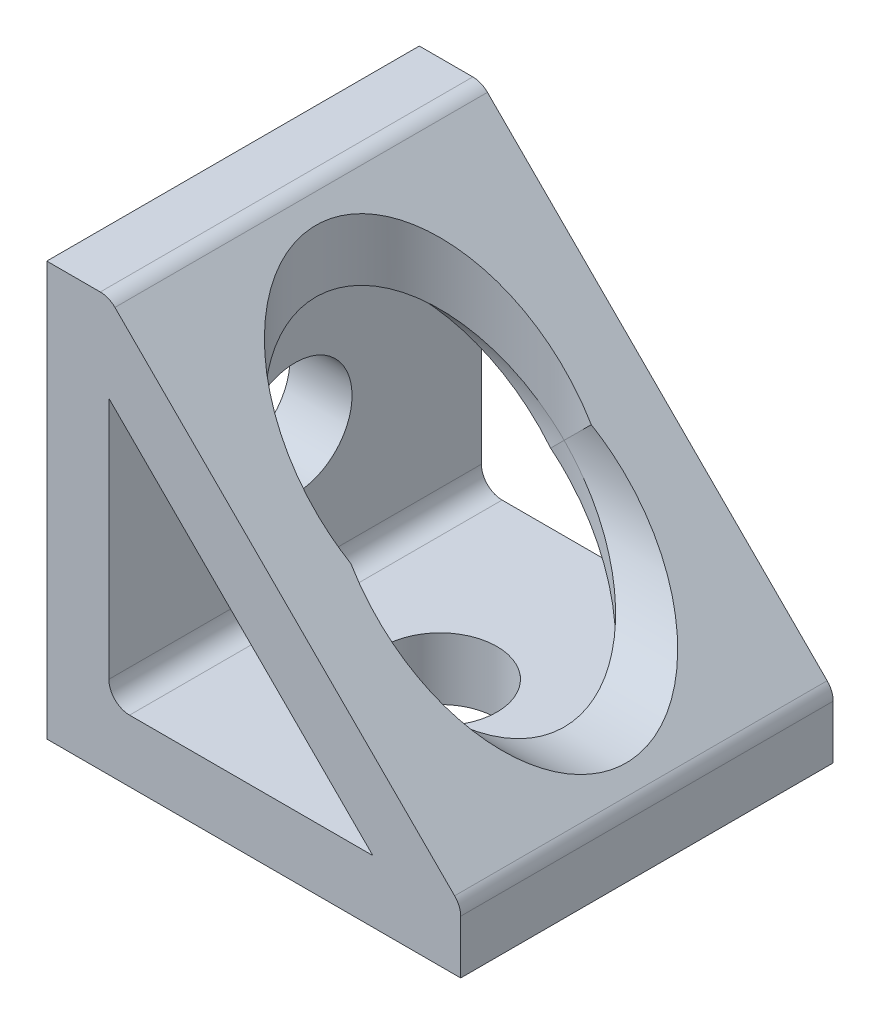
ISO-10303-21;
HEADER;
FILE_DESCRIPTION(('STEP AP214'),'2;1');
FILE_NAME('part.step','',(''),(''),'','','');
FILE_SCHEMA(('AUTOMOTIVE_DESIGN { 1 0 10303 214 1 1 1 1 }'));
ENDSEC;
DATA;
#1=APPLICATION_CONTEXT('core data for automotive mechanical design processes');
#2=APPLICATION_PROTOCOL_DEFINITION('international standard','automotive_design',2000,#1);
#3=PRODUCT_CONTEXT('',#1,'mechanical');
#4=PRODUCT('Part','Part','',(#3));
#5=PRODUCT_RELATED_PRODUCT_CATEGORY('part','',(#4));
#6=PRODUCT_DEFINITION_FORMATION('','',#4);
#7=PRODUCT_DEFINITION_CONTEXT('part definition',#1,'design');
#8=PRODUCT_DEFINITION('design','',#6,#7);
#9=PRODUCT_DEFINITION_SHAPE('','',#8);
#10=(LENGTH_UNIT() NAMED_UNIT(*) SI_UNIT(.MILLI.,.METRE.));
#11=(NAMED_UNIT(*) PLANE_ANGLE_UNIT() SI_UNIT($,.RADIAN.));
#12=(NAMED_UNIT(*) SI_UNIT($,.STERADIAN.) SOLID_ANGLE_UNIT());
#13=UNCERTAINTY_MEASURE_WITH_UNIT(LENGTH_MEASURE(1.E-05),#10,'distance_accuracy_value','');
#14=(GEOMETRIC_REPRESENTATION_CONTEXT(3) GLOBAL_UNCERTAINTY_ASSIGNED_CONTEXT((#13)) GLOBAL_UNIT_ASSIGNED_CONTEXT((#10,
#11,#12)) REPRESENTATION_CONTEXT('',''));
#15=CARTESIAN_POINT('',(0.,0.,0.));
#16=DIRECTION('',(0.,0.,1.));
#17=DIRECTION('',(1.,0.,0.));
#18=AXIS2_PLACEMENT_3D('',#15,#16,#17);
#19=CARTESIAN_POINT('',(4.,4.,-9.));
#20=DIRECTION('',(0.,0.,-1.));
#21=DIRECTION('',(-1.,0.,0.));
#22=AXIS2_PLACEMENT_3D('',#19,#20,#21);
#23=CYLINDRICAL_SURFACE('',#22,1.);
#24=DIRECTION('',(0.,0.,1.));
#25=VECTOR('',#24,1.);
#26=CARTESIAN_POINT('',(3.,4.,-9.));
#27=LINE('',#26,#25);
#28=CARTESIAN_POINT('',(3.,4.,-9.));
#29=VERTEX_POINT('',#28);
#30=CARTESIAN_POINT('',(3.,4.,9.));
#31=VERTEX_POINT('',#30);
#32=EDGE_CURVE('E143',#29,#31,#27,.T.);
#33=ORIENTED_EDGE('',*,*,#32,.T.);
#34=CARTESIAN_POINT('',(4.,4.,9.));
#35=DIRECTION('',(0.,0.,-1.));
#36=DIRECTION('',(-1.,0.,0.));
#37=AXIS2_PLACEMENT_3D('',#34,#35,#36);
#38=CIRCLE('',#37,1.);
#39=CARTESIAN_POINT('',(4.,3.,9.));
#40=VERTEX_POINT('',#39);
#41=EDGE_CURVE('E21',#40,#31,#38,.T.);
#42=ORIENTED_EDGE('',*,*,#41,.F.);
#43=DIRECTION('',(0.,0.,1.));
#44=VECTOR('',#43,1.);
#45=CARTESIAN_POINT('',(4.,3.,-9.));
#46=LINE('',#45,#44);
#47=CARTESIAN_POINT('',(4.,3.,-9.));
#48=VERTEX_POINT('',#47);
#49=EDGE_CURVE('E271',#40,#48,#46,.F.);
#50=ORIENTED_EDGE('',*,*,#49,.T.);
#51=CARTESIAN_POINT('',(4.,4.,-9.));
#52=DIRECTION('',(0.,0.,-1.));
#53=DIRECTION('',(-1.,0.,0.));
#54=AXIS2_PLACEMENT_3D('',#51,#52,#53);
#55=CIRCLE('',#54,1.);
#56=EDGE_CURVE('E141',#29,#48,#55,.F.);
#57=ORIENTED_EDGE('',*,*,#56,.F.);
#58=EDGE_LOOP('',(#33,#42,#50,#57));
#59=FACE_BOUND('',#58,.T.);
#60=ADVANCED_FACE('F18',(#59),#23,.F.);
#61=CARTESIAN_POINT('',(10.,20.,0.));
#62=DIRECTION('',(0.,-1.,0.));
#63=DIRECTION('',(1.,0.,0.));
#64=AXIS2_PLACEMENT_3D('',#61,#62,#63);
#65=CYLINDRICAL_SURFACE('',#64,6.);
#66=CARTESIAN_POINT('',(10.,10.,0.));
#67=DIRECTION('',(-0.707106781186548,-0.707106781186547,0.));
#68=DIRECTION('',(0.707106781186547,-0.707106781186548,0.));
#69=AXIS2_PLACEMENT_3D('',#66,#67,#68);
#70=ELLIPSE('',#69,8.48528137423857,6.);
#71=CARTESIAN_POINT('',(10.,10.,6.));
#72=VERTEX_POINT('',#71);
#73=CARTESIAN_POINT('',(10.,10.,-6.));
#74=VERTEX_POINT('',#73);
#75=EDGE_CURVE('E293',#72,#74,#70,.F.);
#76=ORIENTED_EDGE('',*,*,#75,.T.);
#77=CARTESIAN_POINT('',(10.,10.,0.));
#78=DIRECTION('',(0.707106781186547,-0.707106781186548,0.));
#79=DIRECTION('',(-0.707106781186548,-0.707106781186547,0.));
#80=AXIS2_PLACEMENT_3D('',#77,#78,#79);
#81=ELLIPSE('',#80,8.48528137423857,6.);
#82=CARTESIAN_POINT('',(9.37867965644037,9.37867965644034,-5.96774337842027));
#83=VERTEX_POINT('',#82);
#84=EDGE_CURVE('E308',#74,#83,#81,.F.);
#85=ORIENTED_EDGE('',*,*,#84,.T.);
#86=CARTESIAN_POINT('',(10.,8.75735931288071,0.));
#87=DIRECTION('',(0.707106781186547,0.707106781186548,0.));
#88=DIRECTION('',(0.707106781186548,-0.707106781186547,0.));
#89=AXIS2_PLACEMENT_3D('',#86,#87,#88);
#90=ELLIPSE('',#89,8.48528137423857,6.);
#91=CARTESIAN_POINT('',(15.7573593128807,3.,-1.68902745459798));
#92=VERTEX_POINT('',#91);
#93=EDGE_CURVE('E253',#83,#92,#90,.F.);
#94=ORIENTED_EDGE('',*,*,#93,.T.);
#95=CARTESIAN_POINT('',(10.,3.,0.));
#96=DIRECTION('',(0.,-1.,0.));
#97=DIRECTION('',(1.,0.,0.));
#98=AXIS2_PLACEMENT_3D('',#95,#96,#97);
#99=CIRCLE('',#98,6.);
#100=CARTESIAN_POINT('',(15.7573593128807,3.,1.68902745459798));
#101=VERTEX_POINT('',#100);
#102=EDGE_CURVE('E147',#92,#101,#99,.T.);
#103=ORIENTED_EDGE('',*,*,#102,.T.);
#104=CARTESIAN_POINT('',(10.,8.75735931288071,0.));
#105=DIRECTION('',(0.707106781186547,0.707106781186548,0.));
#106=DIRECTION('',(0.707106781186548,-0.707106781186547,0.));
#107=AXIS2_PLACEMENT_3D('',#104,#105,#106);
#108=ELLIPSE('',#107,8.48528137423857,6.);
#109=CARTESIAN_POINT('',(9.37867965644038,9.37867965644033,5.96774337842026));
#110=VERTEX_POINT('',#109);
#111=EDGE_CURVE('E284',#101,#110,#108,.F.);
#112=ORIENTED_EDGE('',*,*,#111,.T.);
#113=CARTESIAN_POINT('',(10.,10.,0.));
#114=DIRECTION('',(0.707106781186547,-0.707106781186548,0.));
#115=DIRECTION('',(-0.707106781186548,-0.707106781186547,0.));
#116=AXIS2_PLACEMENT_3D('',#113,#114,#115);
#117=ELLIPSE('',#116,8.48528137423857,6.);
#118=EDGE_CURVE('E311',#110,#72,#117,.F.);
#119=ORIENTED_EDGE('',*,*,#118,.T.);
#120=EDGE_LOOP('',(#76,#85,#94,#103,#112,#119));
#121=FACE_BOUND('',#120,.T.);
#122=ADVANCED_FACE('F351',(#121),#65,.F.);
#123=CARTESIAN_POINT('',(20.,10.,0.));
#124=DIRECTION('',(-1.,0.,0.));
#125=DIRECTION('',(0.,-1.,0.));
#126=AXIS2_PLACEMENT_3D('',#123,#124,#125);
#127=CYLINDRICAL_SURFACE('',#126,6.);
#128=ORIENTED_EDGE('',*,*,#84,.F.);
#129=CARTESIAN_POINT('',(10.,10.,0.));
#130=DIRECTION('',(-0.707106781186548,-0.707106781186547,0.));
#131=DIRECTION('',(-0.707106781186547,0.707106781186548,0.));
#132=AXIS2_PLACEMENT_3D('',#129,#130,#131);
#133=ELLIPSE('',#132,8.48528137423857,6.);
#134=EDGE_CURVE('E304',#74,#72,#133,.F.);
#135=ORIENTED_EDGE('',*,*,#134,.T.);
#136=ORIENTED_EDGE('',*,*,#118,.F.);
#137=CARTESIAN_POINT('',(8.75735931288071,10.,0.));
#138=DIRECTION('',(0.707106781186547,0.707106781186548,0.));
#139=DIRECTION('',(-0.707106781186548,0.707106781186547,0.));
#140=AXIS2_PLACEMENT_3D('',#137,#138,#139);
#141=ELLIPSE('',#140,8.48528137423857,6.);
#142=CARTESIAN_POINT('',(3.,15.7573593128807,1.689027454598));
#143=VERTEX_POINT('',#142);
#144=EDGE_CURVE('E281',#110,#143,#141,.F.);
#145=ORIENTED_EDGE('',*,*,#144,.T.);
#146=CARTESIAN_POINT('',(3.,10.,0.));
#147=DIRECTION('',(-1.,0.,0.));
#148=DIRECTION('',(0.,-1.,0.));
#149=AXIS2_PLACEMENT_3D('',#146,#147,#148);
#150=CIRCLE('',#149,6.);
#151=CARTESIAN_POINT('',(3.,15.7573593128807,-1.689027454598));
#152=VERTEX_POINT('',#151);
#153=EDGE_CURVE('E148',#143,#152,#150,.T.);
#154=ORIENTED_EDGE('',*,*,#153,.T.);
#155=CARTESIAN_POINT('',(8.75735931288071,10.,0.));
#156=DIRECTION('',(0.707106781186547,0.707106781186548,0.));
#157=DIRECTION('',(-0.707106781186548,0.707106781186547,0.));
#158=AXIS2_PLACEMENT_3D('',#155,#156,#157);
#159=ELLIPSE('',#158,8.48528137423857,6.);
#160=EDGE_CURVE('E216',#152,#83,#159,.F.);
#161=ORIENTED_EDGE('',*,*,#160,.T.);
#162=EDGE_LOOP('',(#128,#135,#136,#145,#154,#161));
#163=FACE_BOUND('',#162,.T.);
#164=ADVANCED_FACE('F356',(#163),#127,.F.);
#165=CARTESIAN_POINT('',(10.,20.,0.));
#166=DIRECTION('',(0.,-1.,0.));
#167=DIRECTION('',(1.,0.,0.));
#168=AXIS2_PLACEMENT_3D('',#165,#166,#167);
#169=CYLINDRICAL_SURFACE('',#168,6.);
#170=ORIENTED_EDGE('',*,*,#134,.F.);
#171=CARTESIAN_POINT('',(10.,10.,0.));
#172=DIRECTION('',(0.707106781186547,-0.707106781186548,0.));
#173=DIRECTION('',(-0.707106781186548,-0.707106781186547,0.));
#174=AXIS2_PLACEMENT_3D('',#171,#172,#173);
#175=ELLIPSE('',#174,8.48528137423857,6.);
#176=CARTESIAN_POINT('',(11.5,11.5,-5.80947501931113));
#177=VERTEX_POINT('',#176);
#178=EDGE_CURVE('E300',#74,#177,#175,.T.);
#179=ORIENTED_EDGE('',*,*,#178,.T.);
#180=CARTESIAN_POINT('',(10.,13.,0.));
#181=DIRECTION('',(0.707106781186548,0.707106781186548,0.));
#182=DIRECTION('',(0.707106781186548,-0.707106781186548,0.));
#183=AXIS2_PLACEMENT_3D('',#180,#181,#182);
#184=ELLIPSE('',#183,8.48528137423857,6.);
#185=CARTESIAN_POINT('',(11.5,11.5,5.80947501931113));
#186=VERTEX_POINT('',#185);
#187=EDGE_CURVE('E257',#186,#177,#184,.F.);
#188=ORIENTED_EDGE('',*,*,#187,.F.);
#189=CARTESIAN_POINT('',(10.,10.,0.));
#190=DIRECTION('',(0.707106781186547,-0.707106781186548,0.));
#191=DIRECTION('',(-0.707106781186548,-0.707106781186547,0.));
#192=AXIS2_PLACEMENT_3D('',#189,#190,#191);
#193=ELLIPSE('',#192,8.48528137423857,6.);
#194=EDGE_CURVE('E296',#186,#72,#193,.T.);
#195=ORIENTED_EDGE('',*,*,#194,.T.);
#196=EDGE_LOOP('',(#170,#179,#188,#195));
#197=FACE_BOUND('',#196,.T.);
#198=ADVANCED_FACE('F363',(#197),#169,.F.);
#199=CARTESIAN_POINT('',(20.,10.,0.));
#200=DIRECTION('',(-1.,0.,0.));
#201=DIRECTION('',(0.,-1.,0.));
#202=AXIS2_PLACEMENT_3D('',#199,#200,#201);
#203=CYLINDRICAL_SURFACE('',#202,6.);
#204=CARTESIAN_POINT('',(13.,10.,0.));
#205=DIRECTION('',(0.707106781186548,0.707106781186548,0.));
#206=DIRECTION('',(-0.707106781186548,0.707106781186548,0.));
#207=AXIS2_PLACEMENT_3D('',#204,#205,#206);
#208=ELLIPSE('',#207,8.48528137423857,6.);
#209=EDGE_CURVE('E210',#177,#186,#208,.F.);
#210=ORIENTED_EDGE('',*,*,#209,.F.);
#211=ORIENTED_EDGE('',*,*,#178,.F.);
#212=ORIENTED_EDGE('',*,*,#75,.F.);
#213=ORIENTED_EDGE('',*,*,#194,.F.);
#214=EDGE_LOOP('',(#210,#211,#212,#213));
#215=FACE_BOUND('',#214,.T.);
#216=ADVANCED_FACE('F364',(#215),#203,.F.);
#217=CARTESIAN_POINT('',(19.,2.58578643762691,-9.));
#218=DIRECTION('',(0.,0.,1.));
#219=DIRECTION('',(1.,0.,0.));
#220=AXIS2_PLACEMENT_3D('',#217,#218,#219);
#221=CYLINDRICAL_SURFACE('',#220,1.);
#222=CARTESIAN_POINT('',(19.,2.58578643762691,9.));
#223=DIRECTION('',(0.,0.,1.));
#224=DIRECTION('',(1.,0.,0.));
#225=AXIS2_PLACEMENT_3D('',#222,#223,#224);
#226=CIRCLE('',#225,1.);
#227=CARTESIAN_POINT('',(19.7071067811865,3.29289321881345,9.));
#228=VERTEX_POINT('',#227);
#229=CARTESIAN_POINT('',(20.,2.58578643762691,9.));
#230=VERTEX_POINT('',#229);
#231=EDGE_CURVE('E287',#228,#230,#226,.F.);
#232=ORIENTED_EDGE('',*,*,#231,.T.);
#233=DIRECTION('',(0.,0.,-1.));
#234=VECTOR('',#233,1.);
#235=CARTESIAN_POINT('',(20.,2.58578643762691,-9.));
#236=LINE('',#235,#234);
#237=CARTESIAN_POINT('',(20.,2.58578643762691,-9.));
#238=VERTEX_POINT('',#237);
#239=EDGE_CURVE('E187',#238,#230,#236,.F.);
#240=ORIENTED_EDGE('',*,*,#239,.F.);
#241=CARTESIAN_POINT('',(19.,2.58578643762691,-9.));
#242=DIRECTION('',(0.,0.,1.));
#243=DIRECTION('',(1.,0.,0.));
#244=AXIS2_PLACEMENT_3D('',#241,#242,#243);
#245=CIRCLE('',#244,1.);
#246=CARTESIAN_POINT('',(19.7071067811865,3.29289321881345,-9.));
#247=VERTEX_POINT('',#246);
#248=EDGE_CURVE('E290',#238,#247,#245,.T.);
#249=ORIENTED_EDGE('',*,*,#248,.T.);
#250=DIRECTION('',(0.,0.,1.));
#251=VECTOR('',#250,1.);
#252=CARTESIAN_POINT('',(19.7071067811865,3.29289321881346,-9.));
#253=LINE('',#252,#251);
#254=EDGE_CURVE('E206',#228,#247,#253,.F.);
#255=ORIENTED_EDGE('',*,*,#254,.F.);
#256=EDGE_LOOP('',(#232,#240,#249,#255));
#257=FACE_BOUND('',#256,.T.);
#258=ADVANCED_FACE('F530',(#257),#221,.T.);
#259=CARTESIAN_POINT('',(10.,9.,0.));
#260=DIRECTION('',(0.,-1.,0.));
#261=DIRECTION('',(1.,0.,0.));
#262=AXIS2_PLACEMENT_3D('',#259,#260,#261);
#263=CYLINDRICAL_SURFACE('',#262,2.75);
#264=CARTESIAN_POINT('',(10.,0.,0.));
#265=DIRECTION('',(0.,-1.,0.));
#266=DIRECTION('',(1.,0.,0.));
#267=AXIS2_PLACEMENT_3D('',#264,#265,#266);
#268=CIRCLE('',#267,2.75);
#269=CARTESIAN_POINT('',(12.75,0.,0.));
#270=VERTEX_POINT('',#269);
#271=EDGE_CURVE('E202',#270,#270,#268,.F.);
#272=ORIENTED_EDGE('',*,*,#271,.F.);
#273=EDGE_LOOP('',(#272));
#274=FACE_BOUND('',#273,.T.);
#275=CARTESIAN_POINT('',(10.,3.,0.));
#276=DIRECTION('',(0.,-1.,0.));
#277=DIRECTION('',(1.,0.,0.));
#278=AXIS2_PLACEMENT_3D('',#275,#276,#277);
#279=CIRCLE('',#278,2.75);
#280=CARTESIAN_POINT('',(12.75,3.,0.));
#281=VERTEX_POINT('',#280);
#282=EDGE_CURVE('E267',#281,#281,#279,.F.);
#283=ORIENTED_EDGE('',*,*,#282,.T.);
#284=EDGE_LOOP('',(#283));
#285=FACE_BOUND('',#284,.T.);
#286=ADVANCED_FACE('F521',(#274,#285),#263,.F.);
#287=CARTESIAN_POINT('',(3.,15.7573593128807,-9.));
#288=DIRECTION('',(0.707106781186547,0.707106781186548,0.));
#289=DIRECTION('',(-0.707106781186548,0.707106781186547,0.));
#290=AXIS2_PLACEMENT_3D('',#287,#288,#289);
#291=PLANE('',#290);
#292=ORIENTED_EDGE('',*,*,#111,.F.);
#293=DIRECTION('',(0.,0.,1.));
#294=VECTOR('',#293,1.);
#295=CARTESIAN_POINT('',(15.7573593128807,3.,-9.));
#296=LINE('',#295,#294);
#297=CARTESIAN_POINT('',(15.7573593128807,3.,9.));
#298=VERTEX_POINT('',#297);
#299=EDGE_CURVE('E275',#101,#298,#296,.T.);
#300=ORIENTED_EDGE('',*,*,#299,.T.);
#301=DIRECTION('',(-0.707106781186548,0.707106781186547,0.));
#302=VECTOR('',#301,1.);
#303=CARTESIAN_POINT('',(15.7573593128807,3.,9.));
#304=LINE('',#303,#302);
#305=CARTESIAN_POINT('',(3.,15.7573593128807,9.));
#306=VERTEX_POINT('',#305);
#307=EDGE_CURVE('E157',#298,#306,#304,.T.);
#308=ORIENTED_EDGE('',*,*,#307,.T.);
#309=DIRECTION('',(0.,0.,1.));
#310=VECTOR('',#309,1.);
#311=CARTESIAN_POINT('',(3.,15.7573593128807,-9.));
#312=LINE('',#311,#310);
#313=EDGE_CURVE('E154',#306,#143,#312,.F.);
#314=ORIENTED_EDGE('',*,*,#313,.T.);
#315=ORIENTED_EDGE('',*,*,#144,.F.);
#316=EDGE_LOOP('',(#292,#300,#308,#314,#315));
#317=FACE_BOUND('',#316,.T.);
#318=ADVANCED_FACE('F355',(#317),#291,.F.);
#319=CARTESIAN_POINT('',(2.5857864376269,19.,-9.));
#320=DIRECTION('',(0.,0.,1.));
#321=DIRECTION('',(1.,0.,0.));
#322=AXIS2_PLACEMENT_3D('',#319,#320,#321);
#323=CYLINDRICAL_SURFACE('',#322,1.);
#324=CARTESIAN_POINT('',(2.5857864376269,19.,9.));
#325=DIRECTION('',(0.,0.,1.));
#326=DIRECTION('',(1.,0.,0.));
#327=AXIS2_PLACEMENT_3D('',#324,#325,#326);
#328=CIRCLE('',#327,1.);
#329=CARTESIAN_POINT('',(2.5857864376269,20.,9.));
#330=VERTEX_POINT('',#329);
#331=CARTESIAN_POINT('',(3.29289321881345,19.7071067811865,9.));
#332=VERTEX_POINT('',#331);
#333=EDGE_CURVE('E180',#330,#332,#328,.F.);
#334=ORIENTED_EDGE('',*,*,#333,.T.);
#335=DIRECTION('',(0.,0.,1.));
#336=VECTOR('',#335,1.);
#337=CARTESIAN_POINT('',(3.29289321881345,19.7071067811866,-9.));
#338=LINE('',#337,#336);
#339=CARTESIAN_POINT('',(3.29289321881345,19.7071067811865,-9.));
#340=VERTEX_POINT('',#339);
#341=EDGE_CURVE('E192',#340,#332,#338,.T.);
#342=ORIENTED_EDGE('',*,*,#341,.F.);
#343=CARTESIAN_POINT('',(2.5857864376269,19.,-9.));
#344=DIRECTION('',(0.,0.,1.));
#345=DIRECTION('',(1.,0.,0.));
#346=AXIS2_PLACEMENT_3D('',#343,#344,#345);
#347=CIRCLE('',#346,1.);
#348=CARTESIAN_POINT('',(2.5857864376269,20.,-9.));
#349=VERTEX_POINT('',#348);
#350=EDGE_CURVE('E278',#340,#349,#347,.T.);
#351=ORIENTED_EDGE('',*,*,#350,.T.);
#352=DIRECTION('',(0.,0.,1.));
#353=VECTOR('',#352,1.);
#354=CARTESIAN_POINT('',(2.5857864376269,20.,-9.));
#355=LINE('',#354,#353);
#356=EDGE_CURVE('E164',#330,#349,#355,.F.);
#357=ORIENTED_EDGE('',*,*,#356,.F.);
#358=EDGE_LOOP('',(#334,#342,#351,#357));
#359=FACE_BOUND('',#358,.T.);
#360=ADVANCED_FACE('F502',(#359),#323,.T.);
#361=CARTESIAN_POINT('',(3.,3.,-9.));
#362=DIRECTION('',(-1.,0.,0.));
#363=DIRECTION('',(0.,-1.,0.));
#364=AXIS2_PLACEMENT_3D('',#361,#362,#363);
#365=PLANE('',#364);
#366=CARTESIAN_POINT('',(3.,10.,0.));
#367=DIRECTION('',(-1.,0.,0.));
#368=DIRECTION('',(0.,0.,1.));
#369=AXIS2_PLACEMENT_3D('',#366,#367,#368);
#370=CIRCLE('',#369,2.75);
#371=CARTESIAN_POINT('',(3.,10.,2.75));
#372=VERTEX_POINT('',#371);
#373=EDGE_CURVE('E191',#372,#372,#370,.T.);
#374=ORIENTED_EDGE('',*,*,#373,.T.);
#375=EDGE_LOOP('',(#374));
#376=FACE_BOUND('',#375,.T.);
#377=ORIENTED_EDGE('',*,*,#32,.F.);
#378=DIRECTION('',(0.,1.,0.));
#379=VECTOR('',#378,1.);
#380=CARTESIAN_POINT('',(3.,0.,-9.));
#381=LINE('',#380,#379);
#382=CARTESIAN_POINT('',(3.,15.7573593128807,-9.));
#383=VERTEX_POINT('',#382);
#384=EDGE_CURVE('E168',#383,#29,#381,.F.);
#385=ORIENTED_EDGE('',*,*,#384,.F.);
#386=DIRECTION('',(0.,0.,1.));
#387=VECTOR('',#386,1.);
#388=CARTESIAN_POINT('',(3.,15.7573593128807,-9.));
#389=LINE('',#388,#387);
#390=EDGE_CURVE('E211',#383,#152,#389,.T.);
#391=ORIENTED_EDGE('',*,*,#390,.T.);
#392=ORIENTED_EDGE('',*,*,#153,.F.);
#393=ORIENTED_EDGE('',*,*,#313,.F.);
#394=DIRECTION('',(0.,1.,0.));
#395=VECTOR('',#394,1.);
#396=CARTESIAN_POINT('',(3.,0.,9.));
#397=LINE('',#396,#395);
#398=EDGE_CURVE('E134',#306,#31,#397,.F.);
#399=ORIENTED_EDGE('',*,*,#398,.T.);
#400=EDGE_LOOP('',(#377,#385,#391,#392,#393,#399));
#401=FACE_BOUND('',#400,.T.);
#402=ADVANCED_FACE('F151',(#376,#401),#365,.F.);
#403=CARTESIAN_POINT('',(3.,3.,-9.));
#404=DIRECTION('',(0.,-1.,0.));
#405=DIRECTION('',(1.,0.,0.));
#406=AXIS2_PLACEMENT_3D('',#403,#404,#405);
#407=PLANE('',#406);
#408=ORIENTED_EDGE('',*,*,#282,.F.);
#409=EDGE_LOOP('',(#408));
#410=FACE_BOUND('',#409,.T.);
#411=ORIENTED_EDGE('',*,*,#49,.F.);
#412=DIRECTION('',(-1.,0.,0.));
#413=VECTOR('',#412,1.);
#414=CARTESIAN_POINT('',(0.,3.,9.));
#415=LINE('',#414,#413);
#416=EDGE_CURVE('E136',#40,#298,#415,.F.);
#417=ORIENTED_EDGE('',*,*,#416,.T.);
#418=ORIENTED_EDGE('',*,*,#299,.F.);
#419=ORIENTED_EDGE('',*,*,#102,.F.);
#420=DIRECTION('',(0.,0.,1.));
#421=VECTOR('',#420,1.);
#422=CARTESIAN_POINT('',(15.7573593128807,3.,-9.));
#423=LINE('',#422,#421);
#424=CARTESIAN_POINT('',(15.7573593128807,3.,-9.));
#425=VERTEX_POINT('',#424);
#426=EDGE_CURVE('E217',#92,#425,#423,.F.);
#427=ORIENTED_EDGE('',*,*,#426,.T.);
#428=DIRECTION('',(-1.,0.,0.));
#429=VECTOR('',#428,1.);
#430=CARTESIAN_POINT('',(0.,3.,-9.));
#431=LINE('',#430,#429);
#432=EDGE_CURVE('E233',#48,#425,#431,.F.);
#433=ORIENTED_EDGE('',*,*,#432,.F.);
#434=EDGE_LOOP('',(#411,#417,#418,#419,#427,#433));
#435=FACE_BOUND('',#434,.T.);
#436=ADVANCED_FACE('F347',(#410,#435),#407,.F.);
#437=CARTESIAN_POINT('',(3.,15.7573593128807,-9.));
#438=DIRECTION('',(0.707106781186547,0.707106781186548,0.));
#439=DIRECTION('',(-0.707106781186548,0.707106781186547,0.));
#440=AXIS2_PLACEMENT_3D('',#437,#438,#439);
#441=PLANE('',#440);
#442=ORIENTED_EDGE('',*,*,#390,.F.);
#443=DIRECTION('',(-0.707106781186548,0.707106781186547,0.));
#444=VECTOR('',#443,1.);
#445=CARTESIAN_POINT('',(15.7573593128807,3.,-9.));
#446=LINE('',#445,#444);
#447=EDGE_CURVE('E231',#425,#383,#446,.T.);
#448=ORIENTED_EDGE('',*,*,#447,.F.);
#449=ORIENTED_EDGE('',*,*,#426,.F.);
#450=ORIENTED_EDGE('',*,*,#93,.F.);
#451=ORIENTED_EDGE('',*,*,#160,.F.);
#452=EDGE_LOOP('',(#442,#448,#449,#450,#451));
#453=FACE_BOUND('',#452,.T.);
#454=ADVANCED_FACE('F249',(#453),#441,.F.);
#455=CARTESIAN_POINT('',(3.,20.,-9.));
#456=DIRECTION('',(0.707106781186548,0.707106781186548,0.));
#457=DIRECTION('',(-0.707106781186548,0.707106781186548,0.));
#458=AXIS2_PLACEMENT_3D('',#455,#456,#457);
#459=PLANE('',#458);
#460=DIRECTION('',(0.707106781186548,-0.707106781186548,0.));
#461=VECTOR('',#460,1.);
#462=CARTESIAN_POINT('',(3.29289321881345,19.7071067811866,-9.));
#463=LINE('',#462,#461);
#464=EDGE_CURVE('E226',#340,#247,#463,.T.);
#465=ORIENTED_EDGE('',*,*,#464,.F.);
#466=ORIENTED_EDGE('',*,*,#341,.T.);
#467=DIRECTION('',(0.707106781186548,-0.707106781186548,0.));
#468=VECTOR('',#467,1.);
#469=CARTESIAN_POINT('',(3.29289321881345,19.7071067811866,9.));
#470=LINE('',#469,#468);
#471=EDGE_CURVE('E176',#332,#228,#470,.T.);
#472=ORIENTED_EDGE('',*,*,#471,.T.);
#473=ORIENTED_EDGE('',*,*,#254,.T.);
#474=EDGE_LOOP('',(#465,#466,#472,#473));
#475=FACE_BOUND('',#474,.T.);
#476=ORIENTED_EDGE('',*,*,#187,.T.);
#477=ORIENTED_EDGE('',*,*,#209,.T.);
#478=EDGE_LOOP('',(#476,#477));
#479=FACE_BOUND('',#478,.T.);
#480=ADVANCED_FACE('F466',(#475,#479),#459,.T.);
#481=CARTESIAN_POINT('',(20.,3.,-9.));
#482=DIRECTION('',(1.,0.,0.));
#483=DIRECTION('',(0.,0.,-1.));
#484=AXIS2_PLACEMENT_3D('',#481,#482,#483);
#485=PLANE('',#484);
#486=DIRECTION('',(0.,1.,0.));
#487=VECTOR('',#486,1.);
#488=CARTESIAN_POINT('',(20.,0.,9.));
#489=LINE('',#488,#487);
#490=CARTESIAN_POINT('',(20.,0.,9.));
#491=VERTEX_POINT('',#490);
#492=EDGE_CURVE('E172',#230,#491,#489,.F.);
#493=ORIENTED_EDGE('',*,*,#492,.T.);
#494=DIRECTION('',(0.,0.,1.));
#495=VECTOR('',#494,1.);
#496=CARTESIAN_POINT('',(20.,0.,-9.));
#497=LINE('',#496,#495);
#498=CARTESIAN_POINT('',(20.,0.,-9.));
#499=VERTEX_POINT('',#498);
#500=EDGE_CURVE('E198',#499,#491,#497,.T.);
#501=ORIENTED_EDGE('',*,*,#500,.F.);
#502=DIRECTION('',(0.,1.,0.));
#503=VECTOR('',#502,1.);
#504=CARTESIAN_POINT('',(20.,0.,-9.));
#505=LINE('',#504,#503);
#506=EDGE_CURVE('E197',#238,#499,#505,.F.);
#507=ORIENTED_EDGE('',*,*,#506,.F.);
#508=ORIENTED_EDGE('',*,*,#239,.T.);
#509=EDGE_LOOP('',(#493,#501,#507,#508));
#510=FACE_BOUND('',#509,.T.);
#511=ADVANCED_FACE('F456',(#510),#485,.T.);
#512=CARTESIAN_POINT('',(9.,10.,0.));
#513=DIRECTION('',(-1.,0.,0.));
#514=DIRECTION('',(0.,0.,1.));
#515=AXIS2_PLACEMENT_3D('',#512,#513,#514);
#516=CYLINDRICAL_SURFACE('',#515,2.75);
#517=CARTESIAN_POINT('',(0.,10.,0.));
#518=DIRECTION('',(-1.,0.,0.));
#519=DIRECTION('',(0.,0.,1.));
#520=AXIS2_PLACEMENT_3D('',#517,#518,#519);
#521=CIRCLE('',#520,2.75);
#522=CARTESIAN_POINT('',(0.,10.,2.75));
#523=VERTEX_POINT('',#522);
#524=EDGE_CURVE('E378',#523,#523,#521,.F.);
#525=ORIENTED_EDGE('',*,*,#524,.F.);
#526=EDGE_LOOP('',(#525));
#527=FACE_BOUND('',#526,.T.);
#528=ORIENTED_EDGE('',*,*,#373,.F.);
#529=EDGE_LOOP('',(#528));
#530=FACE_BOUND('',#529,.T.);
#531=ADVANCED_FACE('F446',(#527,#530),#516,.F.);
#532=CARTESIAN_POINT('',(0.,0.,-9.));
#533=DIRECTION('',(0.,-1.,0.));
#534=DIRECTION('',(1.,0.,0.));
#535=AXIS2_PLACEMENT_3D('',#532,#533,#534);
#536=PLANE('',#535);
#537=DIRECTION('',(0.,0.,1.));
#538=VECTOR('',#537,1.);
#539=CARTESIAN_POINT('',(0.,0.,-9.));
#540=LINE('',#539,#538);
#541=CARTESIAN_POINT('',(0.,0.,-9.));
#542=VERTEX_POINT('',#541);
#543=CARTESIAN_POINT('',(0.,0.,9.));
#544=VERTEX_POINT('',#543);
#545=EDGE_CURVE('E381',#542,#544,#540,.T.);
#546=ORIENTED_EDGE('',*,*,#545,.F.);
#547=DIRECTION('',(-1.,0.,0.));
#548=VECTOR('',#547,1.);
#549=CARTESIAN_POINT('',(0.,0.,-9.));
#550=LINE('',#549,#548);
#551=EDGE_CURVE('E193',#499,#542,#550,.T.);
#552=ORIENTED_EDGE('',*,*,#551,.F.);
#553=ORIENTED_EDGE('',*,*,#500,.T.);
#554=DIRECTION('',(-1.,0.,0.));
#555=VECTOR('',#554,1.);
#556=CARTESIAN_POINT('',(0.,0.,9.));
#557=LINE('',#556,#555);
#558=EDGE_CURVE('E201',#491,#544,#557,.T.);
#559=ORIENTED_EDGE('',*,*,#558,.T.);
#560=EDGE_LOOP('',(#546,#552,#553,#559));
#561=FACE_BOUND('',#560,.T.);
#562=ORIENTED_EDGE('',*,*,#271,.T.);
#563=EDGE_LOOP('',(#562));
#564=FACE_BOUND('',#563,.T.);
#565=ADVANCED_FACE('F411',(#561,#564),#536,.T.);
#566=CARTESIAN_POINT('',(0.,0.,9.));
#567=DIRECTION('',(0.,0.,-1.));
#568=DIRECTION('',(-1.,0.,0.));
#569=AXIS2_PLACEMENT_3D('',#566,#567,#568);
#570=PLANE('',#569);
#571=ORIENTED_EDGE('',*,*,#307,.F.);
#572=ORIENTED_EDGE('',*,*,#416,.F.);
#573=ORIENTED_EDGE('',*,*,#41,.T.);
#574=ORIENTED_EDGE('',*,*,#398,.F.);
#575=EDGE_LOOP('',(#571,#572,#573,#574));
#576=FACE_BOUND('',#575,.T.);
#577=ORIENTED_EDGE('',*,*,#231,.F.);
#578=ORIENTED_EDGE('',*,*,#471,.F.);
#579=ORIENTED_EDGE('',*,*,#333,.F.);
#580=DIRECTION('',(-1.,0.,0.));
#581=VECTOR('',#580,1.);
#582=CARTESIAN_POINT('',(0.,20.,9.));
#583=LINE('',#582,#581);
#584=CARTESIAN_POINT('',(0.,20.,9.));
#585=VERTEX_POINT('',#584);
#586=EDGE_CURVE('E156',#585,#330,#583,.F.);
#587=ORIENTED_EDGE('',*,*,#586,.F.);
#588=DIRECTION('',(0.,1.,0.));
#589=VECTOR('',#588,1.);
#590=CARTESIAN_POINT('',(0.,0.,9.));
#591=LINE('',#590,#589);
#592=EDGE_CURVE('E186',#544,#585,#591,.T.);
#593=ORIENTED_EDGE('',*,*,#592,.F.);
#594=ORIENTED_EDGE('',*,*,#558,.F.);
#595=ORIENTED_EDGE('',*,*,#492,.F.);
#596=EDGE_LOOP('',(#577,#578,#579,#587,#593,#594,#595));
#597=FACE_BOUND('',#596,.T.);
#598=ADVANCED_FACE('F131',(#576,#597),#570,.F.);
#599=CARTESIAN_POINT('',(0.,20.,-9.));
#600=DIRECTION('',(0.,1.,0.));
#601=DIRECTION('',(-1.,0.,0.));
#602=AXIS2_PLACEMENT_3D('',#599,#600,#601);
#603=PLANE('',#602);
#604=DIRECTION('',(-1.,0.,0.));
#605=VECTOR('',#604,1.);
#606=CARTESIAN_POINT('',(0.,20.,-9.));
#607=LINE('',#606,#605);
#608=CARTESIAN_POINT('',(0.,20.,-9.));
#609=VERTEX_POINT('',#608);
#610=EDGE_CURVE('E37',#609,#349,#607,.F.);
#611=ORIENTED_EDGE('',*,*,#610,.F.);
#612=DIRECTION('',(0.,0.,1.));
#613=VECTOR('',#612,1.);
#614=CARTESIAN_POINT('',(0.,20.,-9.));
#615=LINE('',#614,#613);
#616=EDGE_CURVE('E28',#585,#609,#615,.F.);
#617=ORIENTED_EDGE('',*,*,#616,.F.);
#618=ORIENTED_EDGE('',*,*,#586,.T.);
#619=ORIENTED_EDGE('',*,*,#356,.T.);
#620=EDGE_LOOP('',(#611,#617,#618,#619));
#621=FACE_BOUND('',#620,.T.);
#622=ADVANCED_FACE('F402',(#621),#603,.T.);
#623=CARTESIAN_POINT('',(0.,0.,-9.));
#624=DIRECTION('',(0.,0.,-1.));
#625=DIRECTION('',(-1.,0.,0.));
#626=AXIS2_PLACEMENT_3D('',#623,#624,#625);
#627=PLANE('',#626);
#628=ORIENTED_EDGE('',*,*,#610,.T.);
#629=ORIENTED_EDGE('',*,*,#350,.F.);
#630=ORIENTED_EDGE('',*,*,#464,.T.);
#631=ORIENTED_EDGE('',*,*,#248,.F.);
#632=ORIENTED_EDGE('',*,*,#506,.T.);
#633=ORIENTED_EDGE('',*,*,#551,.T.);
#634=DIRECTION('',(0.,1.,0.));
#635=VECTOR('',#634,1.);
#636=CARTESIAN_POINT('',(0.,0.,-9.));
#637=LINE('',#636,#635);
#638=EDGE_CURVE('E11',#609,#542,#637,.F.);
#639=ORIENTED_EDGE('',*,*,#638,.F.);
#640=EDGE_LOOP('',(#628,#629,#630,#631,#632,#633,#639));
#641=FACE_BOUND('',#640,.T.);
#642=ORIENTED_EDGE('',*,*,#432,.T.);
#643=ORIENTED_EDGE('',*,*,#447,.T.);
#644=ORIENTED_EDGE('',*,*,#384,.T.);
#645=ORIENTED_EDGE('',*,*,#56,.T.);
#646=EDGE_LOOP('',(#642,#643,#644,#645));
#647=FACE_BOUND('',#646,.T.);
#648=ADVANCED_FACE('F244',(#641,#647),#627,.T.);
#649=CARTESIAN_POINT('',(0.,0.,-9.));
#650=DIRECTION('',(-1.,0.,0.));
#651=DIRECTION('',(0.,0.,1.));
#652=AXIS2_PLACEMENT_3D('',#649,#650,#651);
#653=PLANE('',#652);
#654=ORIENTED_EDGE('',*,*,#616,.T.);
#655=ORIENTED_EDGE('',*,*,#638,.T.);
#656=ORIENTED_EDGE('',*,*,#545,.T.);
#657=ORIENTED_EDGE('',*,*,#592,.T.);
#658=EDGE_LOOP('',(#654,#655,#656,#657));
#659=FACE_BOUND('',#658,.T.);
#660=ORIENTED_EDGE('',*,*,#524,.T.);
#661=EDGE_LOOP('',(#660));
#662=FACE_BOUND('',#661,.T.);
#663=ADVANCED_FACE('F395',(#659,#662),#653,.T.);
#664=CLOSED_SHELL('',(#60,#122,#164,#198,#216,#258,#286,#318,#360,#402,#436,#454,#480,#511,#531,
#565,#598,#622,#648,#663));
#665=MANIFOLD_SOLID_BREP('B1',#664);
#666=ADVANCED_BREP_SHAPE_REPRESENTATION('',(#18,#665),#14);
#667=SHAPE_DEFINITION_REPRESENTATION(#9,#666);
ENDSEC;
END-ISO-10303-21;
